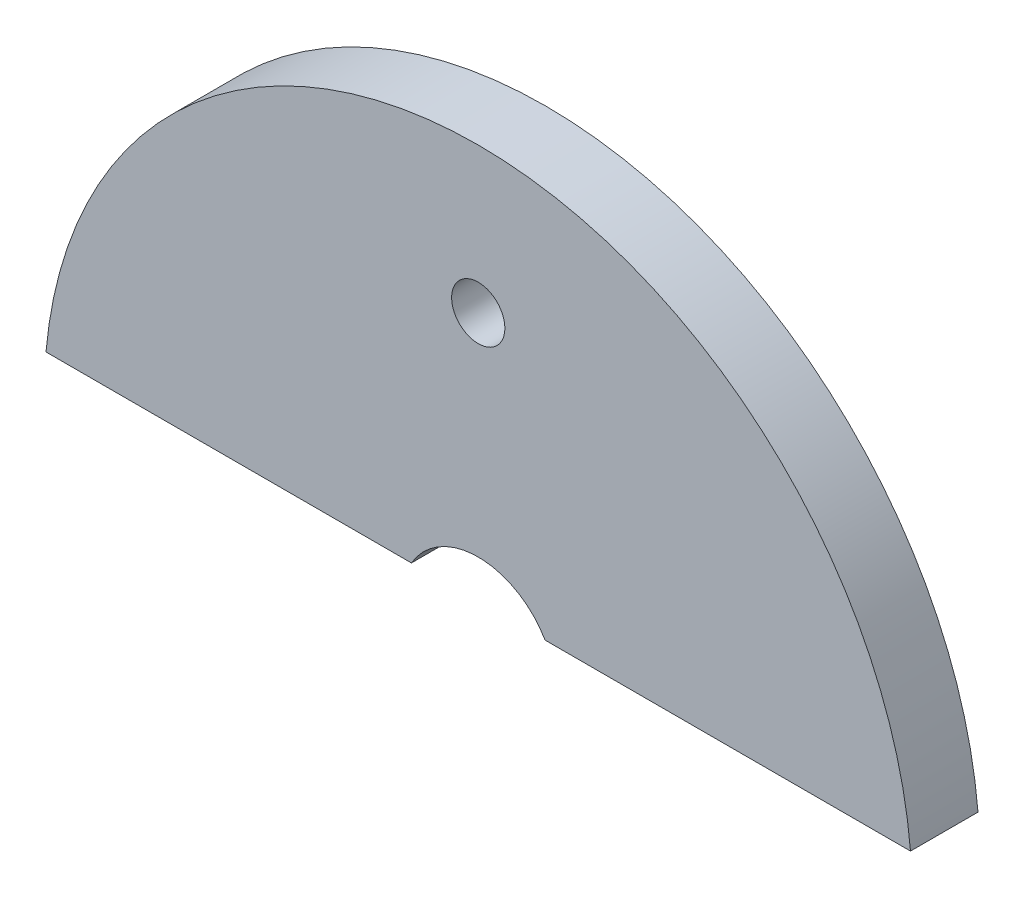
ISO-10303-21;
HEADER;
FILE_DESCRIPTION(('STEP AP214'),'2;1');
FILE_NAME('part.step','',(''),(''),'','','');
FILE_SCHEMA(('AUTOMOTIVE_DESIGN { 1 0 10303 214 1 1 1 1 }'));
ENDSEC;
DATA;
#1=APPLICATION_CONTEXT('core data for automotive mechanical design processes');
#2=APPLICATION_PROTOCOL_DEFINITION('international standard','automotive_design',2000,#1);
#3=PRODUCT_CONTEXT('',#1,'mechanical');
#4=PRODUCT('Part','Part','',(#3));
#5=PRODUCT_RELATED_PRODUCT_CATEGORY('part','',(#4));
#6=PRODUCT_DEFINITION_FORMATION('','',#4);
#7=PRODUCT_DEFINITION_CONTEXT('part definition',#1,'design');
#8=PRODUCT_DEFINITION('design','',#6,#7);
#9=PRODUCT_DEFINITION_SHAPE('','',#8);
#10=(LENGTH_UNIT() NAMED_UNIT(*) SI_UNIT(.MILLI.,.METRE.));
#11=(NAMED_UNIT(*) PLANE_ANGLE_UNIT() SI_UNIT($,.RADIAN.));
#12=(NAMED_UNIT(*) SI_UNIT($,.STERADIAN.) SOLID_ANGLE_UNIT());
#13=UNCERTAINTY_MEASURE_WITH_UNIT(LENGTH_MEASURE(1.E-05),#10,'distance_accuracy_value','');
#14=(GEOMETRIC_REPRESENTATION_CONTEXT(3) GLOBAL_UNCERTAINTY_ASSIGNED_CONTEXT((#13)) GLOBAL_UNIT_ASSIGNED_CONTEXT((#10,
#11,#12)) REPRESENTATION_CONTEXT('',''));
#15=CARTESIAN_POINT('',(0.,0.,0.));
#16=DIRECTION('',(0.,0.,1.));
#17=DIRECTION('',(1.,0.,0.));
#18=AXIS2_PLACEMENT_3D('',#15,#16,#17);
#19=CARTESIAN_POINT('',(0.,0.,4.445));
#20=DIRECTION('',(0.,0.,-1.));
#21=DIRECTION('',(-1.,0.,0.));
#22=AXIS2_PLACEMENT_3D('',#19,#20,#21);
#23=CYLINDRICAL_SURFACE('',#22,5.08);
#24=CARTESIAN_POINT('',(0.,0.,0.));
#25=DIRECTION('',(0.,0.,1.));
#26=DIRECTION('',(1.,0.,0.));
#27=AXIS2_PLACEMENT_3D('',#24,#25,#26);
#28=CIRCLE('',#27,5.08);
#29=CARTESIAN_POINT('',(4.39940905122495,2.54,0.));
#30=VERTEX_POINT('',#29);
#31=CARTESIAN_POINT('',(-4.39940905122495,2.54,0.));
#32=VERTEX_POINT('',#31);
#33=EDGE_CURVE('E104',#30,#32,#28,.T.);
#34=ORIENTED_EDGE('',*,*,#33,.F.);
#35=DIRECTION('',(0.,0.,-1.));
#36=VECTOR('',#35,1.);
#37=CARTESIAN_POINT('',(4.39940905122495,2.54,4.445));
#38=LINE('',#37,#36);
#39=CARTESIAN_POINT('',(4.39940905122495,2.54,4.445));
#40=VERTEX_POINT('',#39);
#41=EDGE_CURVE('E11',#40,#30,#38,.T.);
#42=ORIENTED_EDGE('',*,*,#41,.F.);
#43=CARTESIAN_POINT('',(0.,0.,4.445));
#44=DIRECTION('',(0.,0.,1.));
#45=DIRECTION('',(1.,0.,0.));
#46=AXIS2_PLACEMENT_3D('',#43,#44,#45);
#47=CIRCLE('',#46,5.08);
#48=CARTESIAN_POINT('',(-4.39940905122495,2.54,4.445));
#49=VERTEX_POINT('',#48);
#50=EDGE_CURVE('E92',#40,#49,#47,.T.);
#51=ORIENTED_EDGE('',*,*,#50,.T.);
#52=DIRECTION('',(0.,0.,-1.));
#53=VECTOR('',#52,1.);
#54=CARTESIAN_POINT('',(-4.39940905122495,2.54,4.445));
#55=LINE('',#54,#53);
#56=EDGE_CURVE('E74',#49,#32,#55,.T.);
#57=ORIENTED_EDGE('',*,*,#56,.T.);
#58=EDGE_LOOP('',(#34,#42,#51,#57));
#59=FACE_BOUND('',#58,.T.);
#60=ADVANCED_FACE('F35',(#59),#23,.F.);
#61=CARTESIAN_POINT('',(0.,2.54,4.445));
#62=DIRECTION('',(0.,1.,0.));
#63=DIRECTION('',(0.,0.,1.));
#64=AXIS2_PLACEMENT_3D('',#61,#62,#63);
#65=PLANE('',#64);
#66=DIRECTION('',(1.,0.,0.));
#67=VECTOR('',#66,1.);
#68=CARTESIAN_POINT('',(0.,2.54,0.));
#69=LINE('',#68,#67);
#70=CARTESIAN_POINT('',(28.461887235389,2.54,0.));
#71=VERTEX_POINT('',#70);
#72=EDGE_CURVE('E97',#30,#71,#69,.T.);
#73=ORIENTED_EDGE('',*,*,#72,.T.);
#74=DIRECTION('',(0.,0.,-1.));
#75=VECTOR('',#74,1.);
#76=CARTESIAN_POINT('',(28.461887235389,2.54,4.445));
#77=LINE('',#76,#75);
#78=CARTESIAN_POINT('',(28.461887235389,2.54,4.445));
#79=VERTEX_POINT('',#78);
#80=EDGE_CURVE('E44',#79,#71,#77,.T.);
#81=ORIENTED_EDGE('',*,*,#80,.F.);
#82=DIRECTION('',(1.,0.,0.));
#83=VECTOR('',#82,1.);
#84=CARTESIAN_POINT('',(0.,2.54,4.445));
#85=LINE('',#84,#83);
#86=EDGE_CURVE('E89',#40,#79,#85,.T.);
#87=ORIENTED_EDGE('',*,*,#86,.F.);
#88=ORIENTED_EDGE('',*,*,#41,.T.);
#89=EDGE_LOOP('',(#73,#81,#87,#88));
#90=FACE_BOUND('',#89,.T.);
#91=ADVANCED_FACE('F95',(#90),#65,.F.);
#92=CARTESIAN_POINT('',(0.,0.,4.445));
#93=DIRECTION('',(0.,0.,-1.));
#94=DIRECTION('',(-1.,0.,0.));
#95=AXIS2_PLACEMENT_3D('',#92,#93,#94);
#96=CYLINDRICAL_SURFACE('',#95,28.575);
#97=CARTESIAN_POINT('',(0.,0.,0.));
#98=DIRECTION('',(0.,0.,1.));
#99=DIRECTION('',(1.,0.,0.));
#100=AXIS2_PLACEMENT_3D('',#97,#98,#99);
#101=CIRCLE('',#100,28.575);
#102=CARTESIAN_POINT('',(-28.461887235389,2.54,0.));
#103=VERTEX_POINT('',#102);
#104=EDGE_CURVE('E101',#71,#103,#101,.T.);
#105=ORIENTED_EDGE('',*,*,#104,.T.);
#106=DIRECTION('',(0.,0.,-1.));
#107=VECTOR('',#106,1.);
#108=CARTESIAN_POINT('',(-28.461887235389,2.54,4.445));
#109=LINE('',#108,#107);
#110=CARTESIAN_POINT('',(-28.461887235389,2.54,4.445));
#111=VERTEX_POINT('',#110);
#112=EDGE_CURVE('E88',#111,#103,#109,.T.);
#113=ORIENTED_EDGE('',*,*,#112,.F.);
#114=CARTESIAN_POINT('',(0.,0.,4.445));
#115=DIRECTION('',(0.,0.,1.));
#116=DIRECTION('',(1.,0.,0.));
#117=AXIS2_PLACEMENT_3D('',#114,#115,#116);
#118=CIRCLE('',#117,28.575);
#119=EDGE_CURVE('E82',#79,#111,#118,.T.);
#120=ORIENTED_EDGE('',*,*,#119,.F.);
#121=ORIENTED_EDGE('',*,*,#80,.T.);
#122=EDGE_LOOP('',(#105,#113,#120,#121));
#123=FACE_BOUND('',#122,.T.);
#124=ADVANCED_FACE('F85',(#123),#96,.T.);
#125=CARTESIAN_POINT('',(0.,18.9992,4.445));
#126=DIRECTION('',(0.,0.,-1.));
#127=DIRECTION('',(-1.,0.,0.));
#128=AXIS2_PLACEMENT_3D('',#125,#126,#127);
#129=CYLINDRICAL_SURFACE('',#128,1.7526);
#130=CARTESIAN_POINT('',(0.,18.9992,4.445));
#131=DIRECTION('',(0.,0.,1.));
#132=DIRECTION('',(1.,0.,0.));
#133=AXIS2_PLACEMENT_3D('',#130,#131,#132);
#134=CIRCLE('',#133,1.7526);
#135=CARTESIAN_POINT('',(1.7526,18.9992,4.445));
#136=VERTEX_POINT('',#135);
#137=EDGE_CURVE('E110',#136,#136,#134,.T.);
#138=ORIENTED_EDGE('',*,*,#137,.T.);
#139=EDGE_LOOP('',(#138));
#140=FACE_BOUND('',#139,.T.);
#141=CARTESIAN_POINT('',(0.,18.9992,0.));
#142=DIRECTION('',(0.,0.,1.));
#143=DIRECTION('',(1.,0.,0.));
#144=AXIS2_PLACEMENT_3D('',#141,#142,#143);
#145=CIRCLE('',#144,1.7526);
#146=CARTESIAN_POINT('',(1.7526,18.9992,0.));
#147=VERTEX_POINT('',#146);
#148=EDGE_CURVE('E106',#147,#147,#145,.T.);
#149=ORIENTED_EDGE('',*,*,#148,.F.);
#150=EDGE_LOOP('',(#149));
#151=FACE_BOUND('',#150,.T.);
#152=ADVANCED_FACE('F37',(#140,#151),#129,.F.);
#153=EDGE_CURVE('E67',#103,#32,#69,.T.);
#154=ORIENTED_EDGE('',*,*,#153,.T.);
#155=ORIENTED_EDGE('',*,*,#56,.F.);
#156=EDGE_CURVE('E52',#111,#49,#85,.T.);
#157=ORIENTED_EDGE('',*,*,#156,.F.);
#158=ORIENTED_EDGE('',*,*,#112,.T.);
#159=EDGE_LOOP('',(#154,#155,#157,#158));
#160=FACE_BOUND('',#159,.T.);
#161=ADVANCED_FACE('F115',(#160),#65,.F.);
#162=CARTESIAN_POINT('',(0.,0.,4.445));
#163=DIRECTION('',(0.,0.,1.));
#164=DIRECTION('',(1.,0.,0.));
#165=AXIS2_PLACEMENT_3D('',#162,#163,#164);
#166=PLANE('',#165);
#167=ORIENTED_EDGE('',*,*,#137,.F.);
#168=EDGE_LOOP('',(#167));
#169=FACE_BOUND('',#168,.T.);
#170=ORIENTED_EDGE('',*,*,#50,.F.);
#171=ORIENTED_EDGE('',*,*,#86,.T.);
#172=ORIENTED_EDGE('',*,*,#119,.T.);
#173=ORIENTED_EDGE('',*,*,#156,.T.);
#174=EDGE_LOOP('',(#170,#171,#172,#173));
#175=FACE_BOUND('',#174,.T.);
#176=ADVANCED_FACE('F91',(#169,#175),#166,.T.);
#177=CARTESIAN_POINT('',(0.,0.,0.));
#178=DIRECTION('',(0.,0.,1.));
#179=DIRECTION('',(1.,0.,0.));
#180=AXIS2_PLACEMENT_3D('',#177,#178,#179);
#181=PLANE('',#180);
#182=ORIENTED_EDGE('',*,*,#148,.T.);
#183=EDGE_LOOP('',(#182));
#184=FACE_BOUND('',#183,.T.);
#185=ORIENTED_EDGE('',*,*,#33,.T.);
#186=ORIENTED_EDGE('',*,*,#153,.F.);
#187=ORIENTED_EDGE('',*,*,#104,.F.);
#188=ORIENTED_EDGE('',*,*,#72,.F.);
#189=EDGE_LOOP('',(#185,#186,#187,#188));
#190=FACE_BOUND('',#189,.T.);
#191=ADVANCED_FACE('F116',(#184,#190),#181,.F.);
#192=CLOSED_SHELL('',(#60,#91,#124,#152,#161,#176,#191));
#193=MANIFOLD_SOLID_BREP('B2',#192);
#194=ADVANCED_BREP_SHAPE_REPRESENTATION('',(#18,#193),#14);
#195=SHAPE_DEFINITION_REPRESENTATION(#9,#194);
ENDSEC;
END-ISO-10303-21;
